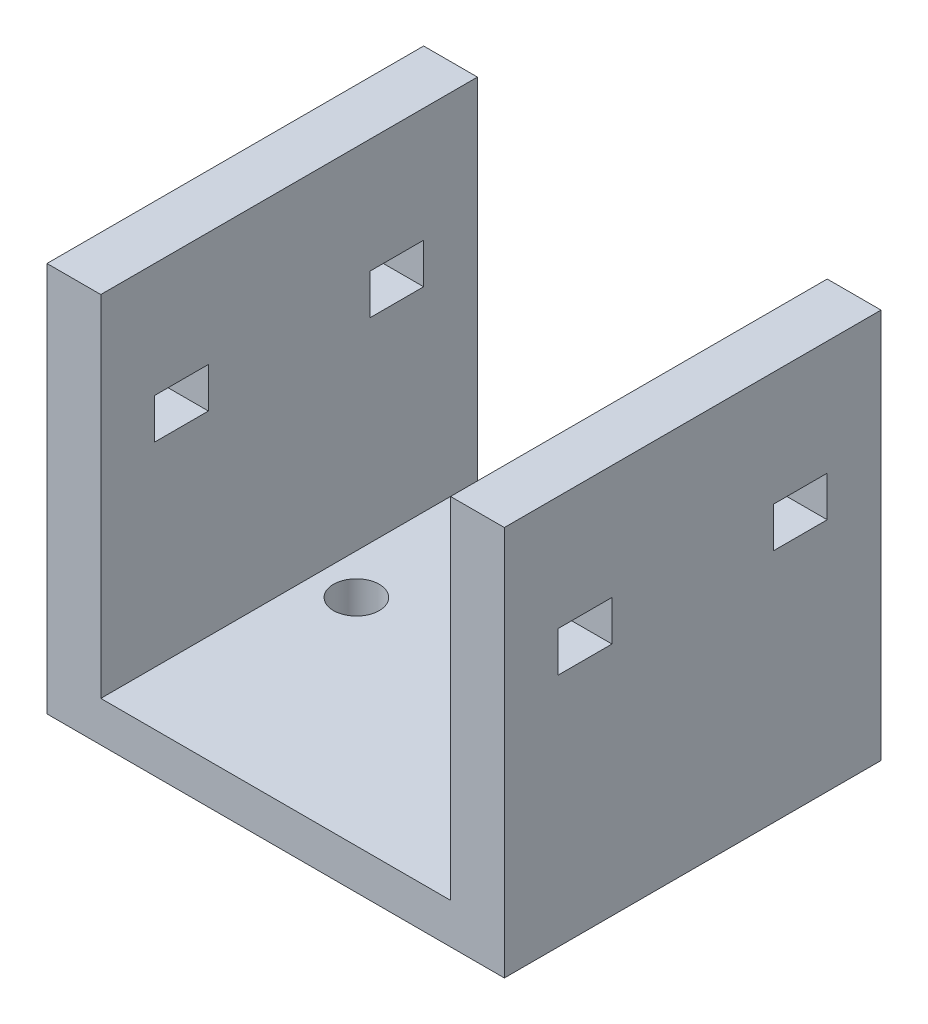
ISO-10303-21;
HEADER;
FILE_DESCRIPTION(('STEP AP214'),'2;1');
FILE_NAME('part.step','',(''),(''),'','','');
FILE_SCHEMA(('AUTOMOTIVE_DESIGN { 1 0 10303 214 1 1 1 1 }'));
ENDSEC;
DATA;
#1=APPLICATION_CONTEXT('core data for automotive mechanical design processes');
#2=APPLICATION_PROTOCOL_DEFINITION('international standard','automotive_design',2000,#1);
#3=PRODUCT_CONTEXT('',#1,'mechanical');
#4=PRODUCT('Part','Part','',(#3));
#5=PRODUCT_RELATED_PRODUCT_CATEGORY('part','',(#4));
#6=PRODUCT_DEFINITION_FORMATION('','',#4);
#7=PRODUCT_DEFINITION_CONTEXT('part definition',#1,'design');
#8=PRODUCT_DEFINITION('design','',#6,#7);
#9=PRODUCT_DEFINITION_SHAPE('','',#8);
#10=(LENGTH_UNIT() NAMED_UNIT(*) SI_UNIT(.MILLI.,.METRE.));
#11=(NAMED_UNIT(*) PLANE_ANGLE_UNIT() SI_UNIT($,.RADIAN.));
#12=(NAMED_UNIT(*) SI_UNIT($,.STERADIAN.) SOLID_ANGLE_UNIT());
#13=UNCERTAINTY_MEASURE_WITH_UNIT(LENGTH_MEASURE(1.E-05),#10,'distance_accuracy_value','');
#14=(GEOMETRIC_REPRESENTATION_CONTEXT(3) GLOBAL_UNCERTAINTY_ASSIGNED_CONTEXT((#13)) GLOBAL_UNIT_ASSIGNED_CONTEXT((#10,
#11,#12)) REPRESENTATION_CONTEXT('',''));
#15=CARTESIAN_POINT('',(0.,0.,0.));
#16=DIRECTION('',(0.,0.,1.));
#17=DIRECTION('',(1.,0.,0.));
#18=AXIS2_PLACEMENT_3D('',#15,#16,#17);
#19=CARTESIAN_POINT('',(-18.,-0.5,3.));
#20=DIRECTION('',(0.,0.,1.));
#21=DIRECTION('',(1.,0.,0.));
#22=AXIS2_PLACEMENT_3D('',#19,#20,#21);
#23=PLANE('',#22);
#24=DIRECTION('',(1.,0.,0.));
#25=VECTOR('',#24,1.);
#26=CARTESIAN_POINT('',(-18.,-0.5,3.));
#27=LINE('',#26,#25);
#28=CARTESIAN_POINT('',(-13.,-0.5,3.));
#29=VERTEX_POINT('',#28);
#30=CARTESIAN_POINT('',(-17.,-0.5,3.));
#31=VERTEX_POINT('',#30);
#32=EDGE_CURVE('E191',#29,#31,#27,.F.);
#33=ORIENTED_EDGE('',*,*,#32,.F.);
#34=DIRECTION('',(0.,1.,0.));
#35=VECTOR('',#34,1.);
#36=CARTESIAN_POINT('',(-13.,-15.,3.));
#37=LINE('',#36,#35);
#38=CARTESIAN_POINT('',(-13.,2.5,3.));
#39=VERTEX_POINT('',#38);
#40=EDGE_CURVE('E179',#39,#29,#37,.F.);
#41=ORIENTED_EDGE('',*,*,#40,.F.);
#42=DIRECTION('',(1.,0.,0.));
#43=VECTOR('',#42,1.);
#44=CARTESIAN_POINT('',(-18.,2.5,3.));
#45=LINE('',#44,#43);
#46=CARTESIAN_POINT('',(-17.,2.5,3.));
#47=VERTEX_POINT('',#46);
#48=EDGE_CURVE('E174',#39,#47,#45,.F.);
#49=ORIENTED_EDGE('',*,*,#48,.T.);
#50=DIRECTION('',(0.,1.,0.));
#51=VECTOR('',#50,1.);
#52=CARTESIAN_POINT('',(-17.,-18.,3.));
#53=LINE('',#52,#51);
#54=EDGE_CURVE('E192',#47,#31,#53,.F.);
#55=ORIENTED_EDGE('',*,*,#54,.T.);
#56=EDGE_LOOP('',(#33,#41,#49,#55));
#57=FACE_BOUND('',#56,.T.);
#58=ADVANCED_FACE('F15',(#57),#23,.T.);
#59=CARTESIAN_POINT('',(-18.,-0.5,3.));
#60=DIRECTION('',(0.,1.,0.));
#61=DIRECTION('',(0.,0.,1.));
#62=AXIS2_PLACEMENT_3D('',#59,#60,#61);
#63=PLANE('',#62);
#64=DIRECTION('',(1.,0.,0.));
#65=VECTOR('',#64,1.);
#66=CARTESIAN_POINT('',(-18.,-0.5,7.));
#67=LINE('',#66,#65);
#68=CARTESIAN_POINT('',(-17.,-0.5,7.));
#69=VERTEX_POINT('',#68);
#70=CARTESIAN_POINT('',(-13.,-0.5,7.));
#71=VERTEX_POINT('',#70);
#72=EDGE_CURVE('E196',#69,#71,#67,.T.);
#73=ORIENTED_EDGE('',*,*,#72,.T.);
#74=DIRECTION('',(0.,0.,-1.));
#75=VECTOR('',#74,1.);
#76=CARTESIAN_POINT('',(-13.,-0.5,-1.));
#77=LINE('',#76,#75);
#78=EDGE_CURVE('E184',#29,#71,#77,.F.);
#79=ORIENTED_EDGE('',*,*,#78,.F.);
#80=ORIENTED_EDGE('',*,*,#32,.T.);
#81=DIRECTION('',(0.,0.,-1.));
#82=VECTOR('',#81,1.);
#83=CARTESIAN_POINT('',(-17.,-0.5,-1.));
#84=LINE('',#83,#82);
#85=EDGE_CURVE('E294',#31,#69,#84,.F.);
#86=ORIENTED_EDGE('',*,*,#85,.T.);
#87=EDGE_LOOP('',(#73,#79,#80,#86));
#88=FACE_BOUND('',#87,.T.);
#89=ADVANCED_FACE('F198',(#88),#63,.T.);
#90=CARTESIAN_POINT('',(-18.,-0.5,7.));
#91=DIRECTION('',(0.,0.,1.));
#92=DIRECTION('',(1.,0.,0.));
#93=AXIS2_PLACEMENT_3D('',#90,#91,#92);
#94=PLANE('',#93);
#95=ORIENTED_EDGE('',*,*,#72,.F.);
#96=DIRECTION('',(0.,1.,0.));
#97=VECTOR('',#96,1.);
#98=CARTESIAN_POINT('',(-17.,-18.,7.));
#99=LINE('',#98,#97);
#100=CARTESIAN_POINT('',(-17.,2.5,7.));
#101=VERTEX_POINT('',#100);
#102=EDGE_CURVE('E291',#69,#101,#99,.T.);
#103=ORIENTED_EDGE('',*,*,#102,.T.);
#104=DIRECTION('',(1.,0.,0.));
#105=VECTOR('',#104,1.);
#106=CARTESIAN_POINT('',(-18.,2.5,7.));
#107=LINE('',#106,#105);
#108=CARTESIAN_POINT('',(-13.,2.5,7.));
#109=VERTEX_POINT('',#108);
#110=EDGE_CURVE('E215',#101,#109,#107,.T.);
#111=ORIENTED_EDGE('',*,*,#110,.T.);
#112=DIRECTION('',(0.,1.,0.));
#113=VECTOR('',#112,1.);
#114=CARTESIAN_POINT('',(-13.,-15.,7.));
#115=LINE('',#114,#113);
#116=EDGE_CURVE('E200',#71,#109,#115,.T.);
#117=ORIENTED_EDGE('',*,*,#116,.F.);
#118=EDGE_LOOP('',(#95,#103,#111,#117));
#119=FACE_BOUND('',#118,.T.);
#120=ADVANCED_FACE('F664',(#119),#94,.F.);
#121=CARTESIAN_POINT('',(-18.,2.5,3.));
#122=DIRECTION('',(0.,1.,0.));
#123=DIRECTION('',(0.,0.,1.));
#124=AXIS2_PLACEMENT_3D('',#121,#122,#123);
#125=PLANE('',#124);
#126=ORIENTED_EDGE('',*,*,#110,.F.);
#127=DIRECTION('',(0.,0.,-1.));
#128=VECTOR('',#127,1.);
#129=CARTESIAN_POINT('',(-17.,2.5,-1.));
#130=LINE('',#129,#128);
#131=EDGE_CURVE('E289',#101,#47,#130,.T.);
#132=ORIENTED_EDGE('',*,*,#131,.T.);
#133=ORIENTED_EDGE('',*,*,#48,.F.);
#134=DIRECTION('',(0.,0.,-1.));
#135=VECTOR('',#134,1.);
#136=CARTESIAN_POINT('',(-13.,2.5,-1.));
#137=LINE('',#136,#135);
#138=EDGE_CURVE('E186',#109,#39,#137,.T.);
#139=ORIENTED_EDGE('',*,*,#138,.F.);
#140=EDGE_LOOP('',(#126,#132,#133,#139));
#141=FACE_BOUND('',#140,.T.);
#142=ADVANCED_FACE('F656',(#141),#125,.F.);
#143=CARTESIAN_POINT('',(-18.,-0.5,19.));
#144=DIRECTION('',(0.,0.,1.));
#145=DIRECTION('',(1.,0.,0.));
#146=AXIS2_PLACEMENT_3D('',#143,#144,#145);
#147=PLANE('',#146);
#148=DIRECTION('',(1.,0.,0.));
#149=VECTOR('',#148,1.);
#150=CARTESIAN_POINT('',(-18.,-0.5,19.));
#151=LINE('',#150,#149);
#152=CARTESIAN_POINT('',(-13.,-0.5,19.));
#153=VERTEX_POINT('',#152);
#154=CARTESIAN_POINT('',(-17.,-0.5,19.));
#155=VERTEX_POINT('',#154);
#156=EDGE_CURVE('E213',#153,#155,#151,.F.);
#157=ORIENTED_EDGE('',*,*,#156,.F.);
#158=DIRECTION('',(0.,1.,0.));
#159=VECTOR('',#158,1.);
#160=CARTESIAN_POINT('',(-13.,-15.,19.));
#161=LINE('',#160,#159);
#162=CARTESIAN_POINT('',(-13.,2.5,19.));
#163=VERTEX_POINT('',#162);
#164=EDGE_CURVE('E375',#163,#153,#161,.F.);
#165=ORIENTED_EDGE('',*,*,#164,.F.);
#166=DIRECTION('',(1.,0.,0.));
#167=VECTOR('',#166,1.);
#168=CARTESIAN_POINT('',(-18.,2.5,19.));
#169=LINE('',#168,#167);
#170=CARTESIAN_POINT('',(-17.,2.5,19.));
#171=VERTEX_POINT('',#170);
#172=EDGE_CURVE('E207',#163,#171,#169,.F.);
#173=ORIENTED_EDGE('',*,*,#172,.T.);
#174=DIRECTION('',(0.,1.,0.));
#175=VECTOR('',#174,1.);
#176=CARTESIAN_POINT('',(-17.,-18.,19.));
#177=LINE('',#176,#175);
#178=EDGE_CURVE('E286',#171,#155,#177,.F.);
#179=ORIENTED_EDGE('',*,*,#178,.T.);
#180=EDGE_LOOP('',(#157,#165,#173,#179));
#181=FACE_BOUND('',#180,.T.);
#182=ADVANCED_FACE('F382',(#181),#147,.T.);
#183=CARTESIAN_POINT('',(-18.,-0.5,19.));
#184=DIRECTION('',(0.,1.,0.));
#185=DIRECTION('',(0.,0.,1.));
#186=AXIS2_PLACEMENT_3D('',#183,#184,#185);
#187=PLANE('',#186);
#188=DIRECTION('',(1.,0.,0.));
#189=VECTOR('',#188,1.);
#190=CARTESIAN_POINT('',(-18.,-0.5,23.));
#191=LINE('',#190,#189);
#192=CARTESIAN_POINT('',(-17.,-0.5,23.));
#193=VERTEX_POINT('',#192);
#194=CARTESIAN_POINT('',(-13.,-0.5,23.));
#195=VERTEX_POINT('',#194);
#196=EDGE_CURVE('E210',#193,#195,#191,.T.);
#197=ORIENTED_EDGE('',*,*,#196,.T.);
#198=DIRECTION('',(0.,0.,-1.));
#199=VECTOR('',#198,1.);
#200=CARTESIAN_POINT('',(-13.,-0.5,-1.));
#201=LINE('',#200,#199);
#202=EDGE_CURVE('E373',#153,#195,#201,.F.);
#203=ORIENTED_EDGE('',*,*,#202,.F.);
#204=ORIENTED_EDGE('',*,*,#156,.T.);
#205=DIRECTION('',(0.,0.,-1.));
#206=VECTOR('',#205,1.);
#207=CARTESIAN_POINT('',(-17.,-0.5,-1.));
#208=LINE('',#207,#206);
#209=EDGE_CURVE('E283',#155,#193,#208,.F.);
#210=ORIENTED_EDGE('',*,*,#209,.T.);
#211=EDGE_LOOP('',(#197,#203,#204,#210));
#212=FACE_BOUND('',#211,.T.);
#213=ADVANCED_FACE('F385',(#212),#187,.T.);
#214=CARTESIAN_POINT('',(-18.,-0.5,23.));
#215=DIRECTION('',(0.,0.,1.));
#216=DIRECTION('',(1.,0.,0.));
#217=AXIS2_PLACEMENT_3D('',#214,#215,#216);
#218=PLANE('',#217);
#219=ORIENTED_EDGE('',*,*,#196,.F.);
#220=DIRECTION('',(0.,1.,0.));
#221=VECTOR('',#220,1.);
#222=CARTESIAN_POINT('',(-17.,-18.,23.));
#223=LINE('',#222,#221);
#224=CARTESIAN_POINT('',(-17.,2.5,23.));
#225=VERTEX_POINT('',#224);
#226=EDGE_CURVE('E280',#193,#225,#223,.T.);
#227=ORIENTED_EDGE('',*,*,#226,.T.);
#228=DIRECTION('',(1.,0.,0.));
#229=VECTOR('',#228,1.);
#230=CARTESIAN_POINT('',(-18.,2.5,23.));
#231=LINE('',#230,#229);
#232=CARTESIAN_POINT('',(-13.,2.5,23.));
#233=VERTEX_POINT('',#232);
#234=EDGE_CURVE('E188',#225,#233,#231,.T.);
#235=ORIENTED_EDGE('',*,*,#234,.T.);
#236=DIRECTION('',(0.,1.,0.));
#237=VECTOR('',#236,1.);
#238=CARTESIAN_POINT('',(-13.,-15.,23.));
#239=LINE('',#238,#237);
#240=EDGE_CURVE('E371',#195,#233,#239,.T.);
#241=ORIENTED_EDGE('',*,*,#240,.F.);
#242=EDGE_LOOP('',(#219,#227,#235,#241));
#243=FACE_BOUND('',#242,.T.);
#244=ADVANCED_FACE('F389',(#243),#218,.F.);
#245=CARTESIAN_POINT('',(-18.,2.5,19.));
#246=DIRECTION('',(0.,1.,0.));
#247=DIRECTION('',(0.,0.,1.));
#248=AXIS2_PLACEMENT_3D('',#245,#246,#247);
#249=PLANE('',#248);
#250=ORIENTED_EDGE('',*,*,#234,.F.);
#251=DIRECTION('',(0.,0.,-1.));
#252=VECTOR('',#251,1.);
#253=CARTESIAN_POINT('',(-17.,2.5,-1.));
#254=LINE('',#253,#252);
#255=EDGE_CURVE('E277',#225,#171,#254,.T.);
#256=ORIENTED_EDGE('',*,*,#255,.T.);
#257=ORIENTED_EDGE('',*,*,#172,.F.);
#258=DIRECTION('',(0.,0.,-1.));
#259=VECTOR('',#258,1.);
#260=CARTESIAN_POINT('',(-13.,2.5,-1.));
#261=LINE('',#260,#259);
#262=EDGE_CURVE('E368',#233,#163,#261,.T.);
#263=ORIENTED_EDGE('',*,*,#262,.F.);
#264=EDGE_LOOP('',(#250,#256,#257,#263));
#265=FACE_BOUND('',#264,.T.);
#266=ADVANCED_FACE('F392',(#265),#249,.F.);
#267=CARTESIAN_POINT('',(13.,-15.,-1.));
#268=DIRECTION('',(1.,0.,0.));
#269=DIRECTION('',(0.,0.,-1.));
#270=AXIS2_PLACEMENT_3D('',#267,#268,#269);
#271=PLANE('',#270);
#272=DIRECTION('',(0.,1.,0.));
#273=VECTOR('',#272,1.);
#274=CARTESIAN_POINT('',(13.,-0.5,23.));
#275=LINE('',#274,#273);
#276=CARTESIAN_POINT('',(13.,2.5,23.));
#277=VERTEX_POINT('',#276);
#278=CARTESIAN_POINT('',(13.,-0.5,23.));
#279=VERTEX_POINT('',#278);
#280=EDGE_CURVE('E332',#277,#279,#275,.F.);
#281=ORIENTED_EDGE('',*,*,#280,.T.);
#282=DIRECTION('',(0.,0.,1.));
#283=VECTOR('',#282,1.);
#284=CARTESIAN_POINT('',(13.,-0.5,19.));
#285=LINE('',#284,#283);
#286=CARTESIAN_POINT('',(13.,-0.5,19.));
#287=VERTEX_POINT('',#286);
#288=EDGE_CURVE('E335',#287,#279,#285,.T.);
#289=ORIENTED_EDGE('',*,*,#288,.F.);
#290=DIRECTION('',(0.,1.,0.));
#291=VECTOR('',#290,1.);
#292=CARTESIAN_POINT('',(13.,-0.5,19.));
#293=LINE('',#292,#291);
#294=CARTESIAN_POINT('',(13.,2.5,19.));
#295=VERTEX_POINT('',#294);
#296=EDGE_CURVE('E340',#295,#287,#293,.F.);
#297=ORIENTED_EDGE('',*,*,#296,.F.);
#298=DIRECTION('',(0.,0.,1.));
#299=VECTOR('',#298,1.);
#300=CARTESIAN_POINT('',(13.,2.5,19.));
#301=LINE('',#300,#299);
#302=EDGE_CURVE('E323',#295,#277,#301,.T.);
#303=ORIENTED_EDGE('',*,*,#302,.T.);
#304=EDGE_LOOP('',(#281,#289,#297,#303));
#305=FACE_BOUND('',#304,.T.);
#306=DIRECTION('',(0.,1.,0.));
#307=VECTOR('',#306,1.);
#308=CARTESIAN_POINT('',(13.,-0.5,7.));
#309=LINE('',#308,#307);
#310=CARTESIAN_POINT('',(13.,2.5,7.));
#311=VERTEX_POINT('',#310);
#312=CARTESIAN_POINT('',(13.,-0.5,7.));
#313=VERTEX_POINT('',#312);
#314=EDGE_CURVE('E354',#311,#313,#309,.F.);
#315=ORIENTED_EDGE('',*,*,#314,.T.);
#316=DIRECTION('',(0.,0.,1.));
#317=VECTOR('',#316,1.);
#318=CARTESIAN_POINT('',(13.,-0.5,3.));
#319=LINE('',#318,#317);
#320=CARTESIAN_POINT('',(13.,-0.5,3.));
#321=VERTEX_POINT('',#320);
#322=EDGE_CURVE('E357',#321,#313,#319,.T.);
#323=ORIENTED_EDGE('',*,*,#322,.F.);
#324=DIRECTION('',(0.,1.,0.));
#325=VECTOR('',#324,1.);
#326=CARTESIAN_POINT('',(13.,-0.5,3.));
#327=LINE('',#326,#325);
#328=CARTESIAN_POINT('',(13.,2.5,3.));
#329=VERTEX_POINT('',#328);
#330=EDGE_CURVE('E362',#329,#321,#327,.F.);
#331=ORIENTED_EDGE('',*,*,#330,.F.);
#332=DIRECTION('',(0.,0.,1.));
#333=VECTOR('',#332,1.);
#334=CARTESIAN_POINT('',(13.,2.5,3.));
#335=LINE('',#334,#333);
#336=EDGE_CURVE('E345',#329,#311,#335,.T.);
#337=ORIENTED_EDGE('',*,*,#336,.T.);
#338=EDGE_LOOP('',(#315,#323,#331,#337));
#339=FACE_BOUND('',#338,.T.);
#340=DIRECTION('',(0.,0.,1.));
#341=VECTOR('',#340,1.);
#342=CARTESIAN_POINT('',(13.,11.,-1.));
#343=LINE('',#342,#341);
#344=CARTESIAN_POINT('',(13.,11.,-1.));
#345=VERTEX_POINT('',#344);
#346=CARTESIAN_POINT('',(13.,11.,27.));
#347=VERTEX_POINT('',#346);
#348=EDGE_CURVE('E364',#345,#347,#343,.T.);
#349=ORIENTED_EDGE('',*,*,#348,.F.);
#350=DIRECTION('',(0.,1.,0.));
#351=VECTOR('',#350,1.);
#352=CARTESIAN_POINT('',(13.,-18.,-1.));
#353=LINE('',#352,#351);
#354=CARTESIAN_POINT('',(13.,-15.,-1.));
#355=VERTEX_POINT('',#354);
#356=EDGE_CURVE('E310',#345,#355,#353,.F.);
#357=ORIENTED_EDGE('',*,*,#356,.T.);
#358=DIRECTION('',(0.,0.,1.));
#359=VECTOR('',#358,1.);
#360=CARTESIAN_POINT('',(13.,-15.,-1.));
#361=LINE('',#360,#359);
#362=CARTESIAN_POINT('',(13.,-15.,27.));
#363=VERTEX_POINT('',#362);
#364=EDGE_CURVE('E316',#363,#355,#361,.F.);
#365=ORIENTED_EDGE('',*,*,#364,.F.);
#366=DIRECTION('',(0.,1.,0.));
#367=VECTOR('',#366,1.);
#368=CARTESIAN_POINT('',(13.,-18.,27.));
#369=LINE('',#368,#367);
#370=EDGE_CURVE('E270',#347,#363,#369,.F.);
#371=ORIENTED_EDGE('',*,*,#370,.F.);
#372=EDGE_LOOP('',(#349,#357,#365,#371));
#373=FACE_BOUND('',#372,.T.);
#374=ADVANCED_FACE('F437',(#305,#339,#373),#271,.F.);
#375=CARTESIAN_POINT('',(-13.,-15.,-1.));
#376=DIRECTION('',(1.,0.,0.));
#377=DIRECTION('',(0.,0.,-1.));
#378=AXIS2_PLACEMENT_3D('',#375,#376,#377);
#379=PLANE('',#378);
#380=ORIENTED_EDGE('',*,*,#240,.T.);
#381=ORIENTED_EDGE('',*,*,#262,.T.);
#382=ORIENTED_EDGE('',*,*,#164,.T.);
#383=ORIENTED_EDGE('',*,*,#202,.T.);
#384=EDGE_LOOP('',(#380,#381,#382,#383));
#385=FACE_BOUND('',#384,.T.);
#386=ORIENTED_EDGE('',*,*,#116,.T.);
#387=ORIENTED_EDGE('',*,*,#138,.T.);
#388=ORIENTED_EDGE('',*,*,#40,.T.);
#389=ORIENTED_EDGE('',*,*,#78,.T.);
#390=EDGE_LOOP('',(#386,#387,#388,#389));
#391=FACE_BOUND('',#390,.T.);
#392=DIRECTION('',(0.,0.,1.));
#393=VECTOR('',#392,1.);
#394=CARTESIAN_POINT('',(-13.,11.,-1.));
#395=LINE('',#394,#393);
#396=CARTESIAN_POINT('',(-13.,11.,27.));
#397=VERTEX_POINT('',#396);
#398=CARTESIAN_POINT('',(-13.,11.,-1.));
#399=VERTEX_POINT('',#398);
#400=EDGE_CURVE('E366',#397,#399,#395,.F.);
#401=ORIENTED_EDGE('',*,*,#400,.F.);
#402=DIRECTION('',(0.,1.,0.));
#403=VECTOR('',#402,1.);
#404=CARTESIAN_POINT('',(-13.,-18.,27.));
#405=LINE('',#404,#403);
#406=CARTESIAN_POINT('',(-13.,-15.,27.));
#407=VERTEX_POINT('',#406);
#408=EDGE_CURVE('E265',#407,#397,#405,.T.);
#409=ORIENTED_EDGE('',*,*,#408,.F.);
#410=DIRECTION('',(0.,0.,1.));
#411=VECTOR('',#410,1.);
#412=CARTESIAN_POINT('',(-13.,-15.,-1.));
#413=LINE('',#412,#411);
#414=CARTESIAN_POINT('',(-13.,-15.,-1.));
#415=VERTEX_POINT('',#414);
#416=EDGE_CURVE('E318',#415,#407,#413,.T.);
#417=ORIENTED_EDGE('',*,*,#416,.F.);
#418=DIRECTION('',(0.,1.,0.));
#419=VECTOR('',#418,1.);
#420=CARTESIAN_POINT('',(-13.,-18.,-1.));
#421=LINE('',#420,#419);
#422=EDGE_CURVE('E304',#415,#399,#421,.T.);
#423=ORIENTED_EDGE('',*,*,#422,.T.);
#424=EDGE_LOOP('',(#401,#409,#417,#423));
#425=FACE_BOUND('',#424,.T.);
#426=ADVANCED_FACE('F181',(#385,#391,#425),#379,.T.);
#427=CARTESIAN_POINT('',(-17.,11.,-1.));
#428=DIRECTION('',(0.,1.,0.));
#429=DIRECTION('',(0.,0.,1.));
#430=AXIS2_PLACEMENT_3D('',#427,#428,#429);
#431=PLANE('',#430);
#432=DIRECTION('',(1.,0.,0.));
#433=VECTOR('',#432,1.);
#434=CARTESIAN_POINT('',(-17.,11.,27.));
#435=LINE('',#434,#433);
#436=CARTESIAN_POINT('',(-17.,11.,27.));
#437=VERTEX_POINT('',#436);
#438=EDGE_CURVE('E262',#397,#437,#435,.F.);
#439=ORIENTED_EDGE('',*,*,#438,.F.);
#440=ORIENTED_EDGE('',*,*,#400,.T.);
#441=DIRECTION('',(1.,0.,0.));
#442=VECTOR('',#441,1.);
#443=CARTESIAN_POINT('',(-17.,11.,-1.));
#444=LINE('',#443,#442);
#445=CARTESIAN_POINT('',(-17.,11.,-1.));
#446=VERTEX_POINT('',#445);
#447=EDGE_CURVE('E302',#399,#446,#444,.F.);
#448=ORIENTED_EDGE('',*,*,#447,.T.);
#449=DIRECTION('',(0.,0.,-1.));
#450=VECTOR('',#449,1.);
#451=CARTESIAN_POINT('',(-17.,11.,-1.));
#452=LINE('',#451,#450);
#453=EDGE_CURVE('E297',#446,#437,#452,.F.);
#454=ORIENTED_EDGE('',*,*,#453,.T.);
#455=EDGE_LOOP('',(#439,#440,#448,#454));
#456=FACE_BOUND('',#455,.T.);
#457=ADVANCED_FACE('F429',(#456),#431,.T.);
#458=CARTESIAN_POINT('',(13.,11.,-1.));
#459=DIRECTION('',(0.,1.,0.));
#460=DIRECTION('',(0.,0.,1.));
#461=AXIS2_PLACEMENT_3D('',#458,#459,#460);
#462=PLANE('',#461);
#463=DIRECTION('',(1.,0.,0.));
#464=VECTOR('',#463,1.);
#465=CARTESIAN_POINT('',(-17.,11.,27.));
#466=LINE('',#465,#464);
#467=CARTESIAN_POINT('',(17.,11.,27.));
#468=VERTEX_POINT('',#467);
#469=EDGE_CURVE('E272',#468,#347,#466,.F.);
#470=ORIENTED_EDGE('',*,*,#469,.F.);
#471=DIRECTION('',(0.,0.,-1.));
#472=VECTOR('',#471,1.);
#473=CARTESIAN_POINT('',(17.,11.,-1.));
#474=LINE('',#473,#472);
#475=CARTESIAN_POINT('',(17.,11.,-1.));
#476=VERTEX_POINT('',#475);
#477=EDGE_CURVE('E257',#476,#468,#474,.F.);
#478=ORIENTED_EDGE('',*,*,#477,.F.);
#479=DIRECTION('',(1.,0.,0.));
#480=VECTOR('',#479,1.);
#481=CARTESIAN_POINT('',(-17.,11.,-1.));
#482=LINE('',#481,#480);
#483=EDGE_CURVE('E313',#476,#345,#482,.F.);
#484=ORIENTED_EDGE('',*,*,#483,.T.);
#485=ORIENTED_EDGE('',*,*,#348,.T.);
#486=EDGE_LOOP('',(#470,#478,#484,#485));
#487=FACE_BOUND('',#486,.T.);
#488=ADVANCED_FACE('F424',(#487),#462,.T.);
#489=CARTESIAN_POINT('',(12.,-0.5,3.));
#490=DIRECTION('',(0.,0.,1.));
#491=DIRECTION('',(1.,0.,0.));
#492=AXIS2_PLACEMENT_3D('',#489,#490,#491);
#493=PLANE('',#492);
#494=DIRECTION('',(1.,0.,0.));
#495=VECTOR('',#494,1.);
#496=CARTESIAN_POINT('',(12.,-0.5,3.));
#497=LINE('',#496,#495);
#498=CARTESIAN_POINT('',(17.,-0.5,3.));
#499=VERTEX_POINT('',#498);
#500=EDGE_CURVE('E359',#499,#321,#497,.F.);
#501=ORIENTED_EDGE('',*,*,#500,.F.);
#502=DIRECTION('',(0.,1.,0.));
#503=VECTOR('',#502,1.);
#504=CARTESIAN_POINT('',(17.,-18.,3.));
#505=LINE('',#504,#503);
#506=CARTESIAN_POINT('',(17.,2.5,3.));
#507=VERTEX_POINT('',#506);
#508=EDGE_CURVE('E254',#507,#499,#505,.F.);
#509=ORIENTED_EDGE('',*,*,#508,.F.);
#510=DIRECTION('',(1.,0.,0.));
#511=VECTOR('',#510,1.);
#512=CARTESIAN_POINT('',(12.,2.5,3.));
#513=LINE('',#512,#511);
#514=EDGE_CURVE('E348',#507,#329,#513,.F.);
#515=ORIENTED_EDGE('',*,*,#514,.T.);
#516=ORIENTED_EDGE('',*,*,#330,.T.);
#517=EDGE_LOOP('',(#501,#509,#515,#516));
#518=FACE_BOUND('',#517,.T.);
#519=ADVANCED_FACE('F500',(#518),#493,.T.);
#520=CARTESIAN_POINT('',(12.,-0.5,3.));
#521=DIRECTION('',(0.,1.,0.));
#522=DIRECTION('',(0.,0.,1.));
#523=AXIS2_PLACEMENT_3D('',#520,#521,#522);
#524=PLANE('',#523);
#525=DIRECTION('',(1.,0.,0.));
#526=VECTOR('',#525,1.);
#527=CARTESIAN_POINT('',(12.,-0.5,7.));
#528=LINE('',#527,#526);
#529=CARTESIAN_POINT('',(17.,-0.5,7.));
#530=VERTEX_POINT('',#529);
#531=EDGE_CURVE('E351',#313,#530,#528,.T.);
#532=ORIENTED_EDGE('',*,*,#531,.T.);
#533=DIRECTION('',(0.,0.,-1.));
#534=VECTOR('',#533,1.);
#535=CARTESIAN_POINT('',(17.,-0.5,-1.));
#536=LINE('',#535,#534);
#537=EDGE_CURVE('E252',#499,#530,#536,.F.);
#538=ORIENTED_EDGE('',*,*,#537,.F.);
#539=ORIENTED_EDGE('',*,*,#500,.T.);
#540=ORIENTED_EDGE('',*,*,#322,.T.);
#541=EDGE_LOOP('',(#532,#538,#539,#540));
#542=FACE_BOUND('',#541,.T.);
#543=ADVANCED_FACE('F496',(#542),#524,.T.);
#544=CARTESIAN_POINT('',(12.,-0.5,7.));
#545=DIRECTION('',(0.,0.,1.));
#546=DIRECTION('',(1.,0.,0.));
#547=AXIS2_PLACEMENT_3D('',#544,#545,#546);
#548=PLANE('',#547);
#549=ORIENTED_EDGE('',*,*,#531,.F.);
#550=ORIENTED_EDGE('',*,*,#314,.F.);
#551=DIRECTION('',(1.,0.,0.));
#552=VECTOR('',#551,1.);
#553=CARTESIAN_POINT('',(12.,2.5,7.));
#554=LINE('',#553,#552);
#555=CARTESIAN_POINT('',(17.,2.5,7.));
#556=VERTEX_POINT('',#555);
#557=EDGE_CURVE('E342',#311,#556,#554,.T.);
#558=ORIENTED_EDGE('',*,*,#557,.T.);
#559=DIRECTION('',(0.,1.,0.));
#560=VECTOR('',#559,1.);
#561=CARTESIAN_POINT('',(17.,-18.,7.));
#562=LINE('',#561,#560);
#563=EDGE_CURVE('E250',#530,#556,#562,.T.);
#564=ORIENTED_EDGE('',*,*,#563,.F.);
#565=EDGE_LOOP('',(#549,#550,#558,#564));
#566=FACE_BOUND('',#565,.T.);
#567=ADVANCED_FACE('F492',(#566),#548,.F.);
#568=CARTESIAN_POINT('',(12.,2.5,3.));
#569=DIRECTION('',(0.,1.,0.));
#570=DIRECTION('',(0.,0.,1.));
#571=AXIS2_PLACEMENT_3D('',#568,#569,#570);
#572=PLANE('',#571);
#573=ORIENTED_EDGE('',*,*,#557,.F.);
#574=ORIENTED_EDGE('',*,*,#336,.F.);
#575=ORIENTED_EDGE('',*,*,#514,.F.);
#576=DIRECTION('',(0.,0.,-1.));
#577=VECTOR('',#576,1.);
#578=CARTESIAN_POINT('',(17.,2.5,-1.));
#579=LINE('',#578,#577);
#580=EDGE_CURVE('E247',#556,#507,#579,.T.);
#581=ORIENTED_EDGE('',*,*,#580,.F.);
#582=EDGE_LOOP('',(#573,#574,#575,#581));
#583=FACE_BOUND('',#582,.T.);
#584=ADVANCED_FACE('F488',(#583),#572,.F.);
#585=CARTESIAN_POINT('',(12.,-0.5,19.));
#586=DIRECTION('',(0.,0.,1.));
#587=DIRECTION('',(1.,0.,0.));
#588=AXIS2_PLACEMENT_3D('',#585,#586,#587);
#589=PLANE('',#588);
#590=DIRECTION('',(1.,0.,0.));
#591=VECTOR('',#590,1.);
#592=CARTESIAN_POINT('',(12.,-0.5,19.));
#593=LINE('',#592,#591);
#594=CARTESIAN_POINT('',(17.,-0.5,19.));
#595=VERTEX_POINT('',#594);
#596=EDGE_CURVE('E337',#595,#287,#593,.F.);
#597=ORIENTED_EDGE('',*,*,#596,.F.);
#598=DIRECTION('',(0.,1.,0.));
#599=VECTOR('',#598,1.);
#600=CARTESIAN_POINT('',(17.,-18.,19.));
#601=LINE('',#600,#599);
#602=CARTESIAN_POINT('',(17.,2.5,19.));
#603=VERTEX_POINT('',#602);
#604=EDGE_CURVE('E245',#603,#595,#601,.F.);
#605=ORIENTED_EDGE('',*,*,#604,.F.);
#606=DIRECTION('',(1.,0.,0.));
#607=VECTOR('',#606,1.);
#608=CARTESIAN_POINT('',(12.,2.5,19.));
#609=LINE('',#608,#607);
#610=EDGE_CURVE('E326',#603,#295,#609,.F.);
#611=ORIENTED_EDGE('',*,*,#610,.T.);
#612=ORIENTED_EDGE('',*,*,#296,.T.);
#613=EDGE_LOOP('',(#597,#605,#611,#612));
#614=FACE_BOUND('',#613,.T.);
#615=ADVANCED_FACE('F484',(#614),#589,.T.);
#616=CARTESIAN_POINT('',(12.,-0.5,19.));
#617=DIRECTION('',(0.,1.,0.));
#618=DIRECTION('',(0.,0.,1.));
#619=AXIS2_PLACEMENT_3D('',#616,#617,#618);
#620=PLANE('',#619);
#621=DIRECTION('',(1.,0.,0.));
#622=VECTOR('',#621,1.);
#623=CARTESIAN_POINT('',(12.,-0.5,23.));
#624=LINE('',#623,#622);
#625=CARTESIAN_POINT('',(17.,-0.5,23.));
#626=VERTEX_POINT('',#625);
#627=EDGE_CURVE('E329',#279,#626,#624,.T.);
#628=ORIENTED_EDGE('',*,*,#627,.T.);
#629=DIRECTION('',(0.,0.,-1.));
#630=VECTOR('',#629,1.);
#631=CARTESIAN_POINT('',(17.,-0.5,-1.));
#632=LINE('',#631,#630);
#633=EDGE_CURVE('E240',#595,#626,#632,.F.);
#634=ORIENTED_EDGE('',*,*,#633,.F.);
#635=ORIENTED_EDGE('',*,*,#596,.T.);
#636=ORIENTED_EDGE('',*,*,#288,.T.);
#637=EDGE_LOOP('',(#628,#634,#635,#636));
#638=FACE_BOUND('',#637,.T.);
#639=ADVANCED_FACE('F480',(#638),#620,.T.);
#640=CARTESIAN_POINT('',(12.,-0.5,23.));
#641=DIRECTION('',(0.,0.,1.));
#642=DIRECTION('',(1.,0.,0.));
#643=AXIS2_PLACEMENT_3D('',#640,#641,#642);
#644=PLANE('',#643);
#645=ORIENTED_EDGE('',*,*,#627,.F.);
#646=ORIENTED_EDGE('',*,*,#280,.F.);
#647=DIRECTION('',(1.,0.,0.));
#648=VECTOR('',#647,1.);
#649=CARTESIAN_POINT('',(12.,2.5,23.));
#650=LINE('',#649,#648);
#651=CARTESIAN_POINT('',(17.,2.5,23.));
#652=VERTEX_POINT('',#651);
#653=EDGE_CURVE('E320',#277,#652,#650,.T.);
#654=ORIENTED_EDGE('',*,*,#653,.T.);
#655=DIRECTION('',(0.,1.,0.));
#656=VECTOR('',#655,1.);
#657=CARTESIAN_POINT('',(17.,-18.,23.));
#658=LINE('',#657,#656);
#659=EDGE_CURVE('E235',#626,#652,#658,.T.);
#660=ORIENTED_EDGE('',*,*,#659,.F.);
#661=EDGE_LOOP('',(#645,#646,#654,#660));
#662=FACE_BOUND('',#661,.T.);
#663=ADVANCED_FACE('F476',(#662),#644,.F.);
#664=CARTESIAN_POINT('',(12.,2.5,19.));
#665=DIRECTION('',(0.,1.,0.));
#666=DIRECTION('',(0.,0.,1.));
#667=AXIS2_PLACEMENT_3D('',#664,#665,#666);
#668=PLANE('',#667);
#669=ORIENTED_EDGE('',*,*,#653,.F.);
#670=ORIENTED_EDGE('',*,*,#302,.F.);
#671=ORIENTED_EDGE('',*,*,#610,.F.);
#672=DIRECTION('',(0.,0.,-1.));
#673=VECTOR('',#672,1.);
#674=CARTESIAN_POINT('',(17.,2.5,-1.));
#675=LINE('',#674,#673);
#676=EDGE_CURVE('E231',#652,#603,#675,.T.);
#677=ORIENTED_EDGE('',*,*,#676,.F.);
#678=EDGE_LOOP('',(#669,#670,#671,#677));
#679=FACE_BOUND('',#678,.T.);
#680=ADVANCED_FACE('F473',(#679),#668,.F.);
#681=CARTESIAN_POINT('',(-17.,-15.,-1.));
#682=DIRECTION('',(0.,1.,0.));
#683=DIRECTION('',(0.,0.,1.));
#684=AXIS2_PLACEMENT_3D('',#681,#682,#683);
#685=PLANE('',#684);
#686=CARTESIAN_POINT('',(10.,-15.,11.));
#687=DIRECTION('',(0.,1.,0.));
#688=DIRECTION('',(0.,0.,1.));
#689=AXIS2_PLACEMENT_3D('',#686,#687,#688);
#690=CIRCLE('',#689,1.7);
#691=CARTESIAN_POINT('',(10.,-15.,12.7));
#692=VERTEX_POINT('',#691);
#693=EDGE_CURVE('E222',#692,#692,#690,.F.);
#694=ORIENTED_EDGE('',*,*,#693,.T.);
#695=EDGE_LOOP('',(#694));
#696=FACE_BOUND('',#695,.T.);
#697=CARTESIAN_POINT('',(-10.,-15.,11.));
#698=DIRECTION('',(0.,1.,0.));
#699=DIRECTION('',(0.,0.,1.));
#700=AXIS2_PLACEMENT_3D('',#697,#698,#699);
#701=CIRCLE('',#700,1.7);
#702=CARTESIAN_POINT('',(-10.,-15.,12.7));
#703=VERTEX_POINT('',#702);
#704=EDGE_CURVE('E18',#703,#703,#701,.F.);
#705=ORIENTED_EDGE('',*,*,#704,.T.);
#706=EDGE_LOOP('',(#705));
#707=FACE_BOUND('',#706,.T.);
#708=DIRECTION('',(1.,0.,0.));
#709=VECTOR('',#708,1.);
#710=CARTESIAN_POINT('',(-17.,-15.,27.));
#711=LINE('',#710,#709);
#712=EDGE_CURVE('E267',#363,#407,#711,.F.);
#713=ORIENTED_EDGE('',*,*,#712,.F.);
#714=ORIENTED_EDGE('',*,*,#364,.T.);
#715=DIRECTION('',(1.,0.,0.));
#716=VECTOR('',#715,1.);
#717=CARTESIAN_POINT('',(-17.,-15.,-1.));
#718=LINE('',#717,#716);
#719=EDGE_CURVE('E307',#355,#415,#718,.F.);
#720=ORIENTED_EDGE('',*,*,#719,.T.);
#721=ORIENTED_EDGE('',*,*,#416,.T.);
#722=EDGE_LOOP('',(#713,#714,#720,#721));
#723=FACE_BOUND('',#722,.T.);
#724=ADVANCED_FACE('F434',(#696,#707,#723),#685,.T.);
#725=CARTESIAN_POINT('',(-17.,-18.,-1.));
#726=DIRECTION('',(0.,0.,1.));
#727=DIRECTION('',(1.,0.,0.));
#728=AXIS2_PLACEMENT_3D('',#725,#726,#727);
#729=PLANE('',#728);
#730=ORIENTED_EDGE('',*,*,#447,.F.);
#731=ORIENTED_EDGE('',*,*,#422,.F.);
#732=ORIENTED_EDGE('',*,*,#719,.F.);
#733=ORIENTED_EDGE('',*,*,#356,.F.);
#734=ORIENTED_EDGE('',*,*,#483,.F.);
#735=DIRECTION('',(0.,1.,0.));
#736=VECTOR('',#735,1.);
#737=CARTESIAN_POINT('',(17.,-18.,-1.));
#738=LINE('',#737,#736);
#739=CARTESIAN_POINT('',(17.,-18.,-1.));
#740=VERTEX_POINT('',#739);
#741=EDGE_CURVE('E259',#740,#476,#738,.T.);
#742=ORIENTED_EDGE('',*,*,#741,.F.);
#743=DIRECTION('',(1.,0.,0.));
#744=VECTOR('',#743,1.);
#745=CARTESIAN_POINT('',(-17.,-18.,-1.));
#746=LINE('',#745,#744);
#747=CARTESIAN_POINT('',(-17.,-18.,-1.));
#748=VERTEX_POINT('',#747);
#749=EDGE_CURVE('E224',#740,#748,#746,.F.);
#750=ORIENTED_EDGE('',*,*,#749,.T.);
#751=DIRECTION('',(0.,1.,0.));
#752=VECTOR('',#751,1.);
#753=CARTESIAN_POINT('',(-17.,-18.,-1.));
#754=LINE('',#753,#752);
#755=EDGE_CURVE('E299',#748,#446,#754,.T.);
#756=ORIENTED_EDGE('',*,*,#755,.T.);
#757=EDGE_LOOP('',(#730,#731,#732,#733,#734,#742,#750,#756));
#758=FACE_BOUND('',#757,.T.);
#759=ADVANCED_FACE('F398',(#758),#729,.F.);
#760=CARTESIAN_POINT('',(-17.,-18.,-1.));
#761=DIRECTION('',(1.,0.,0.));
#762=DIRECTION('',(0.,0.,-1.));
#763=AXIS2_PLACEMENT_3D('',#760,#761,#762);
#764=PLANE('',#763);
#765=ORIENTED_EDGE('',*,*,#226,.F.);
#766=ORIENTED_EDGE('',*,*,#209,.F.);
#767=ORIENTED_EDGE('',*,*,#178,.F.);
#768=ORIENTED_EDGE('',*,*,#255,.F.);
#769=EDGE_LOOP('',(#765,#766,#767,#768));
#770=FACE_BOUND('',#769,.T.);
#771=ORIENTED_EDGE('',*,*,#102,.F.);
#772=ORIENTED_EDGE('',*,*,#85,.F.);
#773=ORIENTED_EDGE('',*,*,#54,.F.);
#774=ORIENTED_EDGE('',*,*,#131,.F.);
#775=EDGE_LOOP('',(#771,#772,#773,#774));
#776=FACE_BOUND('',#775,.T.);
#777=ORIENTED_EDGE('',*,*,#453,.F.);
#778=ORIENTED_EDGE('',*,*,#755,.F.);
#779=DIRECTION('',(0.,0.,1.));
#780=VECTOR('',#779,1.);
#781=CARTESIAN_POINT('',(-17.,-18.,-1.));
#782=LINE('',#781,#780);
#783=CARTESIAN_POINT('',(-17.,-18.,27.));
#784=VERTEX_POINT('',#783);
#785=EDGE_CURVE('E228',#748,#784,#782,.T.);
#786=ORIENTED_EDGE('',*,*,#785,.T.);
#787=DIRECTION('',(0.,1.,0.));
#788=VECTOR('',#787,1.);
#789=CARTESIAN_POINT('',(-17.,-18.,27.));
#790=LINE('',#789,#788);
#791=EDGE_CURVE('E275',#437,#784,#790,.F.);
#792=ORIENTED_EDGE('',*,*,#791,.F.);
#793=EDGE_LOOP('',(#777,#778,#786,#792));
#794=FACE_BOUND('',#793,.T.);
#795=ADVANCED_FACE('F394',(#770,#776,#794),#764,.F.);
#796=CARTESIAN_POINT('',(-17.,-18.,27.));
#797=DIRECTION('',(0.,0.,1.));
#798=DIRECTION('',(1.,0.,0.));
#799=AXIS2_PLACEMENT_3D('',#796,#797,#798);
#800=PLANE('',#799);
#801=ORIENTED_EDGE('',*,*,#408,.T.);
#802=ORIENTED_EDGE('',*,*,#438,.T.);
#803=ORIENTED_EDGE('',*,*,#791,.T.);
#804=DIRECTION('',(1.,0.,0.));
#805=VECTOR('',#804,1.);
#806=CARTESIAN_POINT('',(-17.,-18.,27.));
#807=LINE('',#806,#805);
#808=CARTESIAN_POINT('',(17.,-18.,27.));
#809=VERTEX_POINT('',#808);
#810=EDGE_CURVE('E417',#784,#809,#807,.T.);
#811=ORIENTED_EDGE('',*,*,#810,.T.);
#812=DIRECTION('',(0.,1.,0.));
#813=VECTOR('',#812,1.);
#814=CARTESIAN_POINT('',(17.,-18.,27.));
#815=LINE('',#814,#813);
#816=EDGE_CURVE('E33',#468,#809,#815,.F.);
#817=ORIENTED_EDGE('',*,*,#816,.F.);
#818=ORIENTED_EDGE('',*,*,#469,.T.);
#819=ORIENTED_EDGE('',*,*,#370,.T.);
#820=ORIENTED_EDGE('',*,*,#712,.T.);
#821=EDGE_LOOP('',(#801,#802,#803,#811,#817,#818,#819,#820));
#822=FACE_BOUND('',#821,.T.);
#823=ADVANCED_FACE('F397',(#822),#800,.T.);
#824=CARTESIAN_POINT('',(17.,-18.,-1.));
#825=DIRECTION('',(1.,0.,0.));
#826=DIRECTION('',(0.,0.,-1.));
#827=AXIS2_PLACEMENT_3D('',#824,#825,#826);
#828=PLANE('',#827);
#829=ORIENTED_EDGE('',*,*,#659,.T.);
#830=ORIENTED_EDGE('',*,*,#676,.T.);
#831=ORIENTED_EDGE('',*,*,#604,.T.);
#832=ORIENTED_EDGE('',*,*,#633,.T.);
#833=EDGE_LOOP('',(#829,#830,#831,#832));
#834=FACE_BOUND('',#833,.T.);
#835=ORIENTED_EDGE('',*,*,#563,.T.);
#836=ORIENTED_EDGE('',*,*,#580,.T.);
#837=ORIENTED_EDGE('',*,*,#508,.T.);
#838=ORIENTED_EDGE('',*,*,#537,.T.);
#839=EDGE_LOOP('',(#835,#836,#837,#838));
#840=FACE_BOUND('',#839,.T.);
#841=ORIENTED_EDGE('',*,*,#477,.T.);
#842=ORIENTED_EDGE('',*,*,#816,.T.);
#843=DIRECTION('',(0.,0.,1.));
#844=VECTOR('',#843,1.);
#845=CARTESIAN_POINT('',(17.,-18.,-1.));
#846=LINE('',#845,#844);
#847=EDGE_CURVE('E221',#809,#740,#846,.F.);
#848=ORIENTED_EDGE('',*,*,#847,.T.);
#849=ORIENTED_EDGE('',*,*,#741,.T.);
#850=EDGE_LOOP('',(#841,#842,#848,#849));
#851=FACE_BOUND('',#850,.T.);
#852=ADVANCED_FACE('F420',(#834,#840,#851),#828,.T.);
#853=CARTESIAN_POINT('',(-10.,-11.,11.));
#854=DIRECTION('',(0.,1.,0.));
#855=DIRECTION('',(0.,0.,1.));
#856=AXIS2_PLACEMENT_3D('',#853,#854,#855);
#857=CYLINDRICAL_SURFACE('',#856,1.7);
#858=CARTESIAN_POINT('',(-10.,-18.,11.));
#859=DIRECTION('',(0.,1.,0.));
#860=DIRECTION('',(0.,0.,1.));
#861=AXIS2_PLACEMENT_3D('',#858,#859,#860);
#862=CIRCLE('',#861,1.7);
#863=CARTESIAN_POINT('',(-10.,-18.,12.7));
#864=VERTEX_POINT('',#863);
#865=EDGE_CURVE('E24',#864,#864,#862,.F.);
#866=ORIENTED_EDGE('',*,*,#865,.T.);
#867=EDGE_LOOP('',(#866));
#868=FACE_BOUND('',#867,.T.);
#869=ORIENTED_EDGE('',*,*,#704,.F.);
#870=EDGE_LOOP('',(#869));
#871=FACE_BOUND('',#870,.T.);
#872=ADVANCED_FACE('F456',(#868,#871),#857,.F.);
#873=CARTESIAN_POINT('',(10.,-11.,11.));
#874=DIRECTION('',(0.,1.,0.));
#875=DIRECTION('',(0.,0.,1.));
#876=AXIS2_PLACEMENT_3D('',#873,#874,#875);
#877=CYLINDRICAL_SURFACE('',#876,1.7);
#878=CARTESIAN_POINT('',(10.,-18.,11.));
#879=DIRECTION('',(0.,1.,0.));
#880=DIRECTION('',(0.,0.,1.));
#881=AXIS2_PLACEMENT_3D('',#878,#879,#880);
#882=CIRCLE('',#881,1.7);
#883=CARTESIAN_POINT('',(10.,-18.,12.7));
#884=VERTEX_POINT('',#883);
#885=EDGE_CURVE('E9',#884,#884,#882,.F.);
#886=ORIENTED_EDGE('',*,*,#885,.T.);
#887=EDGE_LOOP('',(#886));
#888=FACE_BOUND('',#887,.T.);
#889=ORIENTED_EDGE('',*,*,#693,.F.);
#890=EDGE_LOOP('',(#889));
#891=FACE_BOUND('',#890,.T.);
#892=ADVANCED_FACE('F450',(#888,#891),#877,.F.);
#893=CARTESIAN_POINT('',(-17.,-18.,-1.));
#894=DIRECTION('',(0.,1.,0.));
#895=DIRECTION('',(0.,0.,1.));
#896=AXIS2_PLACEMENT_3D('',#893,#894,#895);
#897=PLANE('',#896);
#898=ORIENTED_EDGE('',*,*,#885,.F.);
#899=EDGE_LOOP('',(#898));
#900=FACE_BOUND('',#899,.T.);
#901=ORIENTED_EDGE('',*,*,#865,.F.);
#902=EDGE_LOOP('',(#901));
#903=FACE_BOUND('',#902,.T.);
#904=ORIENTED_EDGE('',*,*,#810,.F.);
#905=ORIENTED_EDGE('',*,*,#785,.F.);
#906=ORIENTED_EDGE('',*,*,#749,.F.);
#907=ORIENTED_EDGE('',*,*,#847,.F.);
#908=EDGE_LOOP('',(#904,#905,#906,#907));
#909=FACE_BOUND('',#908,.T.);
#910=ADVANCED_FACE('F415',(#900,#903,#909),#897,.F.);
#911=CLOSED_SHELL('',(#58,#89,#120,#142,#182,#213,#244,#266,#374,#426,#457,#488,#519,#543,#567,
#584,#615,#639,#663,#680,#724,#759,#795,#823,#852,#872,#892,#910));
#912=MANIFOLD_SOLID_BREP('B1',#911);
#913=ADVANCED_BREP_SHAPE_REPRESENTATION('',(#18,#912),#14);
#914=SHAPE_DEFINITION_REPRESENTATION(#9,#913);
ENDSEC;
END-ISO-10303-21;
